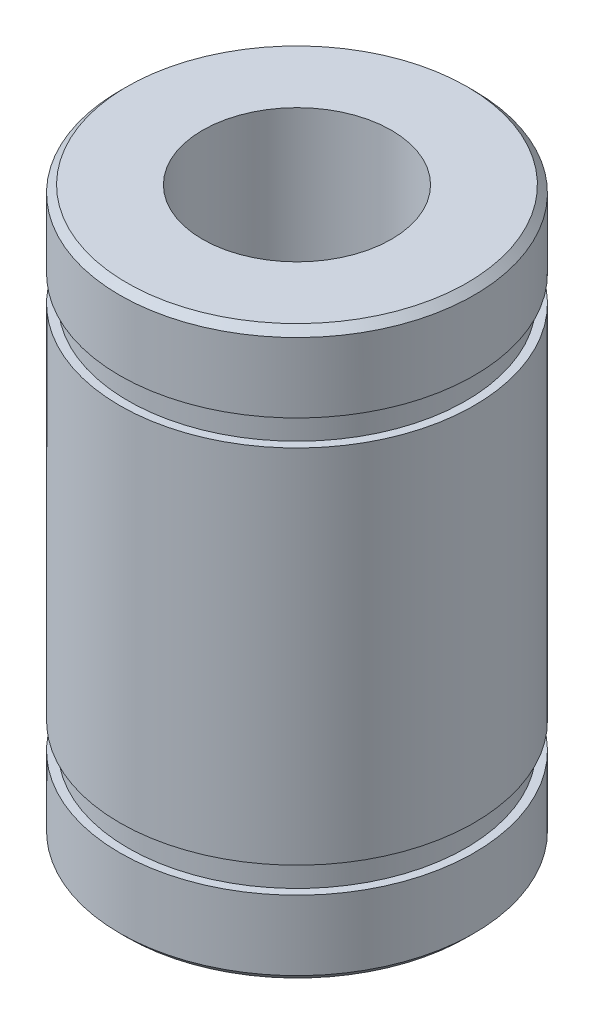
ISO-10303-21;
HEADER;
FILE_DESCRIPTION(('STEP AP214'),'2;1');
FILE_NAME('part.step','',(''),(''),'','','');
FILE_SCHEMA(('AUTOMOTIVE_DESIGN { 1 0 10303 214 1 1 1 1 }'));
ENDSEC;
DATA;
#1=APPLICATION_CONTEXT('core data for automotive mechanical design processes');
#2=APPLICATION_PROTOCOL_DEFINITION('international standard','automotive_design',2000,#1);
#3=PRODUCT_CONTEXT('',#1,'mechanical');
#4=PRODUCT('Part','Part','',(#3));
#5=PRODUCT_RELATED_PRODUCT_CATEGORY('part','',(#4));
#6=PRODUCT_DEFINITION_FORMATION('','',#4);
#7=PRODUCT_DEFINITION_CONTEXT('part definition',#1,'design');
#8=PRODUCT_DEFINITION('design','',#6,#7);
#9=PRODUCT_DEFINITION_SHAPE('','',#8);
#10=(LENGTH_UNIT() NAMED_UNIT(*) SI_UNIT(.MILLI.,.METRE.));
#11=(NAMED_UNIT(*) PLANE_ANGLE_UNIT() SI_UNIT($,.RADIAN.));
#12=(NAMED_UNIT(*) SI_UNIT($,.STERADIAN.) SOLID_ANGLE_UNIT());
#13=UNCERTAINTY_MEASURE_WITH_UNIT(LENGTH_MEASURE(1.E-05),#10,'distance_accuracy_value','');
#14=(GEOMETRIC_REPRESENTATION_CONTEXT(3) GLOBAL_UNCERTAINTY_ASSIGNED_CONTEXT((#13)) GLOBAL_UNIT_ASSIGNED_CONTEXT((#10,
#11,#12)) REPRESENTATION_CONTEXT('',''));
#15=CARTESIAN_POINT('',(0.,0.,0.));
#16=DIRECTION('',(0.,0.,1.));
#17=DIRECTION('',(1.,0.,0.));
#18=AXIS2_PLACEMENT_3D('',#15,#16,#17);
#19=CARTESIAN_POINT('',(0.,0.,0.));
#20=DIRECTION('',(0.,1.,0.));
#21=DIRECTION('',(0.,0.,1.));
#22=AXIS2_PLACEMENT_3D('',#19,#20,#21);
#23=CYLINDRICAL_SURFACE('',#22,4.);
#24=CARTESIAN_POINT('',(0.,0.,0.));
#25=DIRECTION('',(0.,1.,0.));
#26=DIRECTION('',(0.,0.,1.));
#27=AXIS2_PLACEMENT_3D('',#24,#25,#26);
#28=CIRCLE('',#27,4.);
#29=CARTESIAN_POINT('',(0.,0.,4.));
#30=VERTEX_POINT('',#29);
#31=EDGE_CURVE('E74',#30,#30,#28,.F.);
#32=ORIENTED_EDGE('',*,*,#31,.T.);
#33=EDGE_LOOP('',(#32));
#34=FACE_BOUND('',#33,.T.);
#35=CARTESIAN_POINT('',(0.,24.,0.));
#36=DIRECTION('',(0.,1.,0.));
#37=DIRECTION('',(0.,0.,1.));
#38=AXIS2_PLACEMENT_3D('',#35,#36,#37);
#39=CIRCLE('',#38,4.);
#40=CARTESIAN_POINT('',(0.,24.,4.));
#41=VERTEX_POINT('',#40);
#42=EDGE_CURVE('E25',#41,#41,#39,.F.);
#43=ORIENTED_EDGE('',*,*,#42,.F.);
#44=EDGE_LOOP('',(#43));
#45=FACE_BOUND('',#44,.T.);
#46=ADVANCED_FACE('F22',(#34,#45),#23,.F.);
#47=CARTESIAN_POINT('',(0.,24.,0.));
#48=DIRECTION('',(0.,1.,0.));
#49=DIRECTION('',(0.,0.,1.));
#50=AXIS2_PLACEMENT_3D('',#47,#48,#49);
#51=PLANE('',#50);
#52=ORIENTED_EDGE('',*,*,#42,.T.);
#53=EDGE_LOOP('',(#52));
#54=FACE_BOUND('',#53,.T.);
#55=CARTESIAN_POINT('',(0.,24.,0.));
#56=DIRECTION('',(0.,-1.,0.));
#57=DIRECTION('',(0.,0.,-1.));
#58=AXIS2_PLACEMENT_3D('',#55,#56,#57);
#59=CIRCLE('',#58,7.2);
#60=CARTESIAN_POINT('',(0.,24.,-7.2));
#61=VERTEX_POINT('',#60);
#62=EDGE_CURVE('E71',#61,#61,#59,.T.);
#63=ORIENTED_EDGE('',*,*,#62,.F.);
#64=EDGE_LOOP('',(#63));
#65=FACE_BOUND('',#64,.T.);
#66=ADVANCED_FACE('F83',(#54,#65),#51,.T.);
#67=CARTESIAN_POINT('',(0.,0.,0.));
#68=DIRECTION('',(0.,1.,0.));
#69=DIRECTION('',(0.,0.,1.));
#70=AXIS2_PLACEMENT_3D('',#67,#68,#69);
#71=PLANE('',#70);
#72=ORIENTED_EDGE('',*,*,#31,.F.);
#73=EDGE_LOOP('',(#72));
#74=FACE_BOUND('',#73,.T.);
#75=CARTESIAN_POINT('',(0.,0.,0.));
#76=DIRECTION('',(0.,1.,0.));
#77=DIRECTION('',(0.,0.,1.));
#78=AXIS2_PLACEMENT_3D('',#75,#76,#77);
#79=CIRCLE('',#78,7.2);
#80=CARTESIAN_POINT('',(0.,0.,7.2));
#81=VERTEX_POINT('',#80);
#82=EDGE_CURVE('E67',#81,#81,#79,.T.);
#83=ORIENTED_EDGE('',*,*,#82,.F.);
#84=EDGE_LOOP('',(#83));
#85=FACE_BOUND('',#84,.T.);
#86=ADVANCED_FACE('F92',(#74,#85),#71,.F.);
#87=CARTESIAN_POINT('',(0.,23.7,0.));
#88=DIRECTION('',(0.,-1.,0.));
#89=DIRECTION('',(0.,0.,-1.));
#90=AXIS2_PLACEMENT_3D('',#87,#88,#89);
#91=CONICAL_SURFACE('',#90,7.5,0.785398163397451);
#92=CARTESIAN_POINT('',(0.,23.7,0.));
#93=DIRECTION('',(0.,1.,0.));
#94=DIRECTION('',(0.,0.,1.));
#95=AXIS2_PLACEMENT_3D('',#92,#93,#94);
#96=CIRCLE('',#95,7.5);
#97=CARTESIAN_POINT('',(0.,23.7,7.5));
#98=VERTEX_POINT('',#97);
#99=EDGE_CURVE('E42',#98,#98,#96,.F.);
#100=ORIENTED_EDGE('',*,*,#99,.F.);
#101=EDGE_LOOP('',(#100));
#102=FACE_BOUND('',#101,.T.);
#103=ORIENTED_EDGE('',*,*,#62,.T.);
#104=EDGE_LOOP('',(#103));
#105=FACE_BOUND('',#104,.T.);
#106=ADVANCED_FACE('F132',(#102,#105),#91,.T.);
#107=CARTESIAN_POINT('',(0.,0.3,0.));
#108=DIRECTION('',(0.,1.,0.));
#109=DIRECTION('',(0.,0.,1.));
#110=AXIS2_PLACEMENT_3D('',#107,#108,#109);
#111=CONICAL_SURFACE('',#110,7.5,0.785398163397449);
#112=ORIENTED_EDGE('',*,*,#82,.T.);
#113=EDGE_LOOP('',(#112));
#114=FACE_BOUND('',#113,.T.);
#115=CARTESIAN_POINT('',(0.,0.3,0.));
#116=DIRECTION('',(0.,1.,0.));
#117=DIRECTION('',(0.,0.,1.));
#118=AXIS2_PLACEMENT_3D('',#115,#116,#117);
#119=CIRCLE('',#118,7.5);
#120=CARTESIAN_POINT('',(0.,0.3,7.5));
#121=VERTEX_POINT('',#120);
#122=EDGE_CURVE('E66',#121,#121,#119,.T.);
#123=ORIENTED_EDGE('',*,*,#122,.F.);
#124=EDGE_LOOP('',(#123));
#125=FACE_BOUND('',#124,.T.);
#126=ADVANCED_FACE('F128',(#114,#125),#111,.T.);
#127=CARTESIAN_POINT('',(0.,0.,0.));
#128=DIRECTION('',(0.,1.,0.));
#129=DIRECTION('',(0.,0.,1.));
#130=AXIS2_PLACEMENT_3D('',#127,#128,#129);
#131=CYLINDRICAL_SURFACE('',#130,7.5);
#132=CARTESIAN_POINT('',(0.,20.75,0.));
#133=DIRECTION('',(0.,1.,0.));
#134=DIRECTION('',(0.,0.,1.));
#135=AXIS2_PLACEMENT_3D('',#132,#133,#134);
#136=CIRCLE('',#135,7.5);
#137=CARTESIAN_POINT('',(0.,20.75,7.5));
#138=VERTEX_POINT('',#137);
#139=EDGE_CURVE('E62',#138,#138,#136,.T.);
#140=ORIENTED_EDGE('',*,*,#139,.T.);
#141=EDGE_LOOP('',(#140));
#142=FACE_BOUND('',#141,.T.);
#143=ORIENTED_EDGE('',*,*,#99,.T.);
#144=EDGE_LOOP('',(#143));
#145=FACE_BOUND('',#144,.T.);
#146=ADVANCED_FACE('F124',(#142,#145),#131,.T.);
#147=CARTESIAN_POINT('',(0.,0.,0.));
#148=DIRECTION('',(0.,1.,0.));
#149=DIRECTION('',(0.,0.,1.));
#150=AXIS2_PLACEMENT_3D('',#147,#148,#149);
#151=CYLINDRICAL_SURFACE('',#150,7.5);
#152=ORIENTED_EDGE('',*,*,#122,.T.);
#153=EDGE_LOOP('',(#152));
#154=FACE_BOUND('',#153,.T.);
#155=CARTESIAN_POINT('',(0.,3.25,0.));
#156=DIRECTION('',(0.,1.,0.));
#157=DIRECTION('',(0.,0.,1.));
#158=AXIS2_PLACEMENT_3D('',#155,#156,#157);
#159=CIRCLE('',#158,7.5);
#160=CARTESIAN_POINT('',(0.,3.25,7.5));
#161=VERTEX_POINT('',#160);
#162=EDGE_CURVE('E59',#161,#161,#159,.T.);
#163=ORIENTED_EDGE('',*,*,#162,.F.);
#164=EDGE_LOOP('',(#163));
#165=FACE_BOUND('',#164,.T.);
#166=ADVANCED_FACE('F120',(#154,#165),#151,.T.);
#167=CARTESIAN_POINT('',(0.,20.75,0.));
#168=DIRECTION('',(0.,1.,0.));
#169=DIRECTION('',(0.,0.,1.));
#170=AXIS2_PLACEMENT_3D('',#167,#168,#169);
#171=PLANE('',#170);
#172=CARTESIAN_POINT('',(0.,20.75,0.));
#173=DIRECTION('',(0.,-1.,0.));
#174=DIRECTION('',(0.,0.,-1.));
#175=AXIS2_PLACEMENT_3D('',#172,#173,#174);
#176=CIRCLE('',#175,7.15);
#177=CARTESIAN_POINT('',(0.,20.75,-7.15));
#178=VERTEX_POINT('',#177);
#179=EDGE_CURVE('E55',#178,#178,#176,.T.);
#180=ORIENTED_EDGE('',*,*,#179,.F.);
#181=EDGE_LOOP('',(#180));
#182=FACE_BOUND('',#181,.T.);
#183=ORIENTED_EDGE('',*,*,#139,.F.);
#184=EDGE_LOOP('',(#183));
#185=FACE_BOUND('',#184,.T.);
#186=ADVANCED_FACE('F116',(#182,#185),#171,.F.);
#187=CARTESIAN_POINT('',(0.,3.25,0.));
#188=DIRECTION('',(0.,1.,0.));
#189=DIRECTION('',(0.,0.,1.));
#190=AXIS2_PLACEMENT_3D('',#187,#188,#189);
#191=PLANE('',#190);
#192=CARTESIAN_POINT('',(0.,3.25,0.));
#193=DIRECTION('',(0.,1.,0.));
#194=DIRECTION('',(0.,0.,1.));
#195=AXIS2_PLACEMENT_3D('',#192,#193,#194);
#196=CIRCLE('',#195,7.15);
#197=CARTESIAN_POINT('',(0.,3.25,7.15));
#198=VERTEX_POINT('',#197);
#199=EDGE_CURVE('E51',#198,#198,#196,.T.);
#200=ORIENTED_EDGE('',*,*,#199,.F.);
#201=EDGE_LOOP('',(#200));
#202=FACE_BOUND('',#201,.T.);
#203=ORIENTED_EDGE('',*,*,#162,.T.);
#204=EDGE_LOOP('',(#203));
#205=FACE_BOUND('',#204,.T.);
#206=ADVANCED_FACE('F112',(#202,#205),#191,.T.);
#207=CARTESIAN_POINT('',(0.,20.75,0.));
#208=DIRECTION('',(0.,-1.,0.));
#209=DIRECTION('',(0.,0.,-1.));
#210=AXIS2_PLACEMENT_3D('',#207,#208,#209);
#211=CYLINDRICAL_SURFACE('',#210,7.15);
#212=CARTESIAN_POINT('',(0.,19.65,0.));
#213=DIRECTION('',(0.,-1.,0.));
#214=DIRECTION('',(0.,0.,-1.));
#215=AXIS2_PLACEMENT_3D('',#212,#213,#214);
#216=CIRCLE('',#215,7.15);
#217=CARTESIAN_POINT('',(0.,19.65,-7.15));
#218=VERTEX_POINT('',#217);
#219=EDGE_CURVE('E48',#218,#218,#216,.T.);
#220=ORIENTED_EDGE('',*,*,#219,.F.);
#221=EDGE_LOOP('',(#220));
#222=FACE_BOUND('',#221,.T.);
#223=ORIENTED_EDGE('',*,*,#179,.T.);
#224=EDGE_LOOP('',(#223));
#225=FACE_BOUND('',#224,.T.);
#226=ADVANCED_FACE('F108',(#222,#225),#211,.T.);
#227=CARTESIAN_POINT('',(0.,3.25,0.));
#228=DIRECTION('',(0.,1.,0.));
#229=DIRECTION('',(0.,0.,1.));
#230=AXIS2_PLACEMENT_3D('',#227,#228,#229);
#231=CYLINDRICAL_SURFACE('',#230,7.15);
#232=CARTESIAN_POINT('',(0.,4.35,0.));
#233=DIRECTION('',(0.,1.,0.));
#234=DIRECTION('',(0.,0.,1.));
#235=AXIS2_PLACEMENT_3D('',#232,#233,#234);
#236=CIRCLE('',#235,7.15);
#237=CARTESIAN_POINT('',(0.,4.35,7.15));
#238=VERTEX_POINT('',#237);
#239=EDGE_CURVE('E39',#238,#238,#236,.F.);
#240=ORIENTED_EDGE('',*,*,#239,.T.);
#241=EDGE_LOOP('',(#240));
#242=FACE_BOUND('',#241,.T.);
#243=ORIENTED_EDGE('',*,*,#199,.T.);
#244=EDGE_LOOP('',(#243));
#245=FACE_BOUND('',#244,.T.);
#246=ADVANCED_FACE('F105',(#242,#245),#231,.T.);
#247=CARTESIAN_POINT('',(0.,19.65,0.));
#248=DIRECTION('',(0.,1.,0.));
#249=DIRECTION('',(0.,0.,1.));
#250=AXIS2_PLACEMENT_3D('',#247,#248,#249);
#251=PLANE('',#250);
#252=ORIENTED_EDGE('',*,*,#219,.T.);
#253=EDGE_LOOP('',(#252));
#254=FACE_BOUND('',#253,.T.);
#255=CARTESIAN_POINT('',(0.,19.65,0.));
#256=DIRECTION('',(0.,1.,0.));
#257=DIRECTION('',(0.,0.,1.));
#258=AXIS2_PLACEMENT_3D('',#255,#256,#257);
#259=CIRCLE('',#258,7.5);
#260=CARTESIAN_POINT('',(0.,19.65,7.5));
#261=VERTEX_POINT('',#260);
#262=EDGE_CURVE('E30',#261,#261,#259,.F.);
#263=ORIENTED_EDGE('',*,*,#262,.F.);
#264=EDGE_LOOP('',(#263));
#265=FACE_BOUND('',#264,.T.);
#266=ADVANCED_FACE('F98',(#254,#265),#251,.T.);
#267=CARTESIAN_POINT('',(0.,4.35,0.));
#268=DIRECTION('',(0.,1.,0.));
#269=DIRECTION('',(0.,0.,1.));
#270=AXIS2_PLACEMENT_3D('',#267,#268,#269);
#271=PLANE('',#270);
#272=ORIENTED_EDGE('',*,*,#239,.F.);
#273=EDGE_LOOP('',(#272));
#274=FACE_BOUND('',#273,.T.);
#275=CARTESIAN_POINT('',(0.,4.35,0.));
#276=DIRECTION('',(0.,1.,0.));
#277=DIRECTION('',(0.,0.,1.));
#278=AXIS2_PLACEMENT_3D('',#275,#276,#277);
#279=CIRCLE('',#278,7.5);
#280=CARTESIAN_POINT('',(0.,4.35,7.5));
#281=VERTEX_POINT('',#280);
#282=EDGE_CURVE('E12',#281,#281,#279,.T.);
#283=ORIENTED_EDGE('',*,*,#282,.F.);
#284=EDGE_LOOP('',(#283));
#285=FACE_BOUND('',#284,.T.);
#286=ADVANCED_FACE('F94',(#274,#285),#271,.F.);
#287=CARTESIAN_POINT('',(0.,0.,0.));
#288=DIRECTION('',(0.,1.,0.));
#289=DIRECTION('',(0.,0.,1.));
#290=AXIS2_PLACEMENT_3D('',#287,#288,#289);
#291=CYLINDRICAL_SURFACE('',#290,7.5);
#292=ORIENTED_EDGE('',*,*,#282,.T.);
#293=EDGE_LOOP('',(#292));
#294=FACE_BOUND('',#293,.T.);
#295=ORIENTED_EDGE('',*,*,#262,.T.);
#296=EDGE_LOOP('',(#295));
#297=FACE_BOUND('',#296,.T.);
#298=ADVANCED_FACE('F93',(#294,#297),#291,.T.);
#299=CLOSED_SHELL('',(#46,#66,#86,#106,#126,#146,#166,#186,#206,#226,#246,#266,#286,#298));
#300=MANIFOLD_SOLID_BREP('B1',#299);
#301=ADVANCED_BREP_SHAPE_REPRESENTATION('',(#18,#300),#14);
#302=SHAPE_DEFINITION_REPRESENTATION(#9,#301);
ENDSEC;
END-ISO-10303-21;
